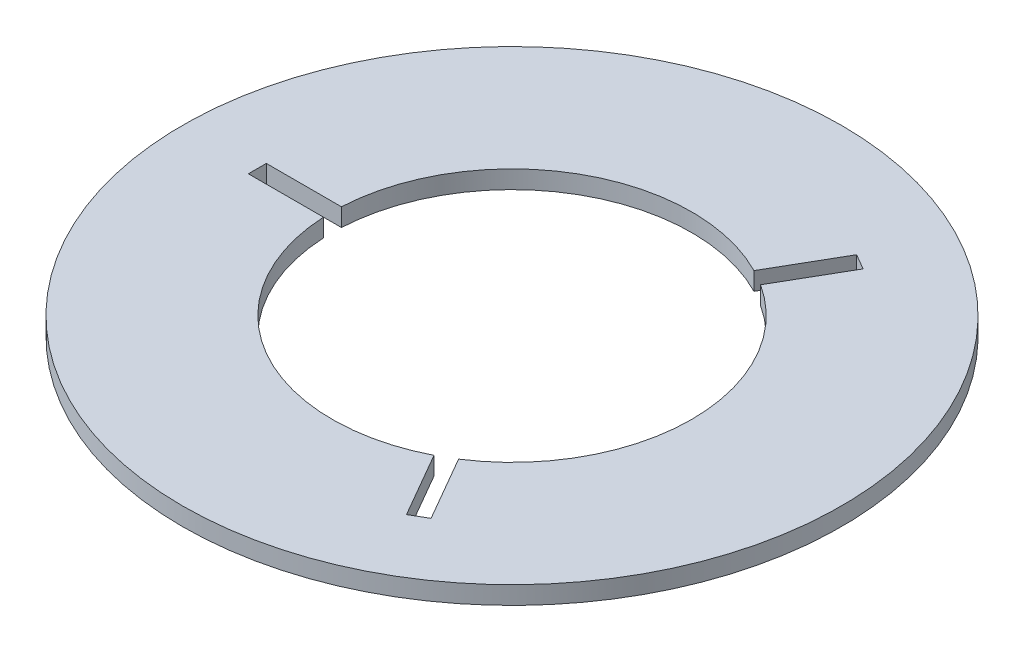
ISO-10303-21;
HEADER;
FILE_DESCRIPTION(('STEP AP214'),'2;1');
FILE_NAME('part.step','',(''),(''),'','','');
FILE_SCHEMA(('AUTOMOTIVE_DESIGN { 1 0 10303 214 1 1 1 1 }'));
ENDSEC;
DATA;
#1=APPLICATION_CONTEXT('core data for automotive mechanical design processes');
#2=APPLICATION_PROTOCOL_DEFINITION('international standard','automotive_design',2000,#1);
#3=PRODUCT_CONTEXT('',#1,'mechanical');
#4=PRODUCT('Part','Part','',(#3));
#5=PRODUCT_RELATED_PRODUCT_CATEGORY('part','',(#4));
#6=PRODUCT_DEFINITION_FORMATION('','',#4);
#7=PRODUCT_DEFINITION_CONTEXT('part definition',#1,'design');
#8=PRODUCT_DEFINITION('design','',#6,#7);
#9=PRODUCT_DEFINITION_SHAPE('','',#8);
#10=(LENGTH_UNIT() NAMED_UNIT(*) SI_UNIT(.MILLI.,.METRE.));
#11=(NAMED_UNIT(*) PLANE_ANGLE_UNIT() SI_UNIT($,.RADIAN.));
#12=(NAMED_UNIT(*) SI_UNIT($,.STERADIAN.) SOLID_ANGLE_UNIT());
#13=UNCERTAINTY_MEASURE_WITH_UNIT(LENGTH_MEASURE(1.E-05),#10,'distance_accuracy_value','');
#14=(GEOMETRIC_REPRESENTATION_CONTEXT(3) GLOBAL_UNCERTAINTY_ASSIGNED_CONTEXT((#13)) GLOBAL_UNIT_ASSIGNED_CONTEXT((#10,
#11,#12)) REPRESENTATION_CONTEXT('',''));
#15=CARTESIAN_POINT('',(0.,0.,0.));
#16=DIRECTION('',(0.,0.,1.));
#17=DIRECTION('',(1.,0.,0.));
#18=AXIS2_PLACEMENT_3D('',#15,#16,#17);
#19=CARTESIAN_POINT('',(0.,0.,0.));
#20=DIRECTION('',(0.,1.,0.));
#21=DIRECTION('',(0.,0.,1.));
#22=AXIS2_PLACEMENT_3D('',#19,#20,#21);
#23=CYLINDRICAL_SURFACE('',#22,30.);
#24=CARTESIAN_POINT('',(0.,0.,0.));
#25=DIRECTION('',(0.,1.,0.));
#26=DIRECTION('',(0.,0.,1.));
#27=AXIS2_PLACEMENT_3D('',#24,#25,#26);
#28=CIRCLE('',#27,30.);
#29=CARTESIAN_POINT('',(16.2802763722554,0.,25.1982658380092));
#30=VERTEX_POINT('',#29);
#31=CARTESIAN_POINT('',(16.280276372255,0.,-25.1982658380094));
#32=VERTEX_POINT('',#31);
#33=EDGE_CURVE('E195',#30,#32,#28,.T.);
#34=ORIENTED_EDGE('',*,*,#33,.F.);
#35=DIRECTION('',(0.,1.,0.));
#36=VECTOR('',#35,1.);
#37=CARTESIAN_POINT('',(16.2802763722554,0.,25.1982658380092));
#38=LINE('',#37,#36);
#39=CARTESIAN_POINT('',(16.2802763722554,3.,25.1982658380092));
#40=VERTEX_POINT('',#39);
#41=EDGE_CURVE('E11',#30,#40,#38,.T.);
#42=ORIENTED_EDGE('',*,*,#41,.T.);
#43=CARTESIAN_POINT('',(0.,3.,0.));
#44=DIRECTION('',(0.,1.,0.));
#45=DIRECTION('',(0.,0.,1.));
#46=AXIS2_PLACEMENT_3D('',#43,#44,#45);
#47=CIRCLE('',#46,30.);
#48=CARTESIAN_POINT('',(16.280276372255,3.,-25.1982658380094));
#49=VERTEX_POINT('',#48);
#50=EDGE_CURVE('E200',#40,#49,#47,.T.);
#51=ORIENTED_EDGE('',*,*,#50,.T.);
#52=DIRECTION('',(0.,1.,0.));
#53=VECTOR('',#52,1.);
#54=CARTESIAN_POINT('',(16.280276372255,0.,-25.1982658380094));
#55=LINE('',#54,#53);
#56=EDGE_CURVE('E212',#49,#32,#55,.F.);
#57=ORIENTED_EDGE('',*,*,#56,.T.);
#58=EDGE_LOOP('',(#34,#42,#51,#57));
#59=FACE_BOUND('',#58,.T.);
#60=ADVANCED_FACE('F33',(#59),#23,.F.);
#61=CARTESIAN_POINT('',(13.6822001609017,0.,-26.6982658380094));
#62=VERTEX_POINT('',#61);
#63=CARTESIAN_POINT('',(-29.9624765331573,0.,-1.49999999999999));
#64=VERTEX_POINT('',#63);
#65=EDGE_CURVE('E196',#62,#64,#28,.T.);
#66=ORIENTED_EDGE('',*,*,#65,.F.);
#67=DIRECTION('',(0.,1.,0.));
#68=VECTOR('',#67,1.);
#69=CARTESIAN_POINT('',(13.6822001609017,0.,-26.6982658380094));
#70=LINE('',#69,#68);
#71=CARTESIAN_POINT('',(13.6822001609017,3.,-26.6982658380094));
#72=VERTEX_POINT('',#71);
#73=EDGE_CURVE('E214',#62,#72,#70,.T.);
#74=ORIENTED_EDGE('',*,*,#73,.T.);
#75=CARTESIAN_POINT('',(-29.9624765331573,3.,-1.49999999999999));
#76=VERTEX_POINT('',#75);
#77=EDGE_CURVE('E190',#72,#76,#47,.T.);
#78=ORIENTED_EDGE('',*,*,#77,.T.);
#79=DIRECTION('',(0.,1.,0.));
#80=VECTOR('',#79,1.);
#81=CARTESIAN_POINT('',(-29.9624765331573,0.,-1.49999999999999));
#82=LINE('',#81,#80);
#83=EDGE_CURVE('E204',#76,#64,#82,.F.);
#84=ORIENTED_EDGE('',*,*,#83,.T.);
#85=EDGE_LOOP('',(#66,#74,#78,#84));
#86=FACE_BOUND('',#85,.T.);
#87=ADVANCED_FACE('F241',(#86),#23,.F.);
#88=CARTESIAN_POINT('',(0.,3.,0.));
#89=DIRECTION('',(0.,-1.,0.));
#90=DIRECTION('',(0.,0.,-1.));
#91=AXIS2_PLACEMENT_3D('',#88,#89,#90);
#92=CYLINDRICAL_SURFACE('',#91,55.);
#93=CARTESIAN_POINT('',(0.,3.,0.));
#94=DIRECTION('',(0.,1.,0.));
#95=DIRECTION('',(0.,0.,1.));
#96=AXIS2_PLACEMENT_3D('',#93,#94,#95);
#97=CIRCLE('',#96,55.);
#98=CARTESIAN_POINT('',(0.,3.,55.));
#99=VERTEX_POINT('',#98);
#100=EDGE_CURVE('E201',#99,#99,#97,.T.);
#101=ORIENTED_EDGE('',*,*,#100,.F.);
#102=EDGE_LOOP('',(#101));
#103=FACE_BOUND('',#102,.T.);
#104=CARTESIAN_POINT('',(0.,0.,0.));
#105=DIRECTION('',(0.,1.,0.));
#106=DIRECTION('',(0.,0.,1.));
#107=AXIS2_PLACEMENT_3D('',#104,#105,#106);
#108=CIRCLE('',#107,55.);
#109=CARTESIAN_POINT('',(0.,0.,55.));
#110=VERTEX_POINT('',#109);
#111=EDGE_CURVE('E194',#110,#110,#108,.T.);
#112=ORIENTED_EDGE('',*,*,#111,.T.);
#113=EDGE_LOOP('',(#112));
#114=FACE_BOUND('',#113,.T.);
#115=ADVANCED_FACE('F35',(#103,#114),#92,.T.);
#116=CARTESIAN_POINT('',(0.,3.,0.));
#117=DIRECTION('',(0.,1.,0.));
#118=DIRECTION('',(0.,0.,1.));
#119=AXIS2_PLACEMENT_3D('',#116,#117,#118);
#120=PLANE('',#119);
#121=DIRECTION('',(-0.500000000000004,0.,-0.866025403784436));
#122=VECTOR('',#121,1.);
#123=CARTESIAN_POINT('',(22.5490381056768,3.,36.0560796608385));
#124=LINE('',#123,#122);
#125=CARTESIAN_POINT('',(22.5490381056768,3.,36.0560796608385));
#126=VERTEX_POINT('',#125);
#127=EDGE_CURVE('E144',#126,#40,#124,.T.);
#128=ORIENTED_EDGE('',*,*,#127,.F.);
#129=DIRECTION('',(0.866025403784436,0.,-0.500000000000004));
#130=VECTOR('',#129,1.);
#131=CARTESIAN_POINT('',(19.9509618943235,3.,37.5560796608386));
#132=LINE('',#131,#130);
#133=CARTESIAN_POINT('',(19.9509618943235,3.,37.5560796608386));
#134=VERTEX_POINT('',#133);
#135=EDGE_CURVE('E146',#134,#126,#132,.T.);
#136=ORIENTED_EDGE('',*,*,#135,.F.);
#137=DIRECTION('',(0.500000000000004,0.,0.866025403784436));
#138=VECTOR('',#137,1.);
#139=CARTESIAN_POINT('',(19.9509618943235,3.,37.5560796608386));
#140=LINE('',#139,#138);
#141=CARTESIAN_POINT('',(13.6822001609021,3.,26.6982658380092));
#142=VERTEX_POINT('',#141);
#143=EDGE_CURVE('E124',#142,#134,#140,.T.);
#144=ORIENTED_EDGE('',*,*,#143,.F.);
#145=CARTESIAN_POINT('',(-29.9624765331573,3.,1.50000000000001));
#146=VERTEX_POINT('',#145);
#147=EDGE_CURVE('E197',#146,#142,#47,.T.);
#148=ORIENTED_EDGE('',*,*,#147,.F.);
#149=DIRECTION('',(1.,0.,0.));
#150=VECTOR('',#149,1.);
#151=CARTESIAN_POINT('',(-42.5,3.,1.50000000000001));
#152=LINE('',#151,#150);
#153=CARTESIAN_POINT('',(-42.5,3.,1.50000000000001));
#154=VERTEX_POINT('',#153);
#155=EDGE_CURVE('E177',#154,#146,#152,.T.);
#156=ORIENTED_EDGE('',*,*,#155,.F.);
#157=DIRECTION('',(0.,0.,1.));
#158=VECTOR('',#157,1.);
#159=CARTESIAN_POINT('',(-42.5,3.,-1.49999999999999));
#160=LINE('',#159,#158);
#161=CARTESIAN_POINT('',(-42.5,3.,-1.49999999999999));
#162=VERTEX_POINT('',#161);
#163=EDGE_CURVE('E184',#162,#154,#160,.T.);
#164=ORIENTED_EDGE('',*,*,#163,.F.);
#165=DIRECTION('',(-1.,0.,0.));
#166=VECTOR('',#165,1.);
#167=CARTESIAN_POINT('',(-42.5,3.,-1.49999999999999));
#168=LINE('',#167,#166);
#169=EDGE_CURVE('E153',#76,#162,#168,.T.);
#170=ORIENTED_EDGE('',*,*,#169,.F.);
#171=ORIENTED_EDGE('',*,*,#77,.F.);
#172=DIRECTION('',(-0.499999999999992,0.,0.866025403784443));
#173=VECTOR('',#172,1.);
#174=CARTESIAN_POINT('',(19.950961894323,3.,-37.5560796608388));
#175=LINE('',#174,#173);
#176=CARTESIAN_POINT('',(19.950961894323,3.,-37.5560796608388));
#177=VERTEX_POINT('',#176);
#178=EDGE_CURVE('E157',#177,#72,#175,.T.);
#179=ORIENTED_EDGE('',*,*,#178,.F.);
#180=DIRECTION('',(-0.866025403784443,0.,-0.499999999999992));
#181=VECTOR('',#180,1.);
#182=CARTESIAN_POINT('',(22.5490381056763,3.,-36.0560796608389));
#183=LINE('',#182,#181);
#184=CARTESIAN_POINT('',(22.5490381056763,3.,-36.0560796608389));
#185=VERTEX_POINT('',#184);
#186=EDGE_CURVE('E166',#185,#177,#183,.T.);
#187=ORIENTED_EDGE('',*,*,#186,.F.);
#188=DIRECTION('',(0.499999999999992,0.,-0.866025403784443));
#189=VECTOR('',#188,1.);
#190=CARTESIAN_POINT('',(22.5490381056763,3.,-36.0560796608389));
#191=LINE('',#190,#189);
#192=EDGE_CURVE('E164',#49,#185,#191,.T.);
#193=ORIENTED_EDGE('',*,*,#192,.F.);
#194=ORIENTED_EDGE('',*,*,#50,.F.);
#195=EDGE_LOOP('',(#128,#136,#144,#148,#156,#164,#170,#171,#179,#187,#193,#194));
#196=FACE_BOUND('',#195,.T.);
#197=ORIENTED_EDGE('',*,*,#100,.T.);
#198=EDGE_LOOP('',(#197));
#199=FACE_BOUND('',#198,.T.);
#200=ADVANCED_FACE('F221',(#196,#199),#120,.T.);
#201=CARTESIAN_POINT('',(0.,0.,0.));
#202=DIRECTION('',(0.,1.,0.));
#203=DIRECTION('',(0.,0.,1.));
#204=AXIS2_PLACEMENT_3D('',#201,#202,#203);
#205=PLANE('',#204);
#206=DIRECTION('',(0.866025403784436,0.,-0.500000000000004));
#207=VECTOR('',#206,1.);
#208=CARTESIAN_POINT('',(19.9509618943235,0.,37.5560796608386));
#209=LINE('',#208,#207);
#210=CARTESIAN_POINT('',(19.9509618943235,0.,37.5560796608386));
#211=VERTEX_POINT('',#210);
#212=CARTESIAN_POINT('',(22.5490381056768,0.,36.0560796608385));
#213=VERTEX_POINT('',#212);
#214=EDGE_CURVE('E132',#211,#213,#209,.T.);
#215=ORIENTED_EDGE('',*,*,#214,.T.);
#216=DIRECTION('',(-0.500000000000004,0.,-0.866025403784436));
#217=VECTOR('',#216,1.);
#218=CARTESIAN_POINT('',(22.5490381056768,0.,36.0560796608385));
#219=LINE('',#218,#217);
#220=EDGE_CURVE('E129',#213,#30,#219,.T.);
#221=ORIENTED_EDGE('',*,*,#220,.T.);
#222=ORIENTED_EDGE('',*,*,#33,.T.);
#223=DIRECTION('',(0.499999999999992,0.,-0.866025403784443));
#224=VECTOR('',#223,1.);
#225=CARTESIAN_POINT('',(22.5490381056763,0.,-36.0560796608389));
#226=LINE('',#225,#224);
#227=CARTESIAN_POINT('',(22.5490381056763,0.,-36.0560796608389));
#228=VERTEX_POINT('',#227);
#229=EDGE_CURVE('E48',#32,#228,#226,.T.);
#230=ORIENTED_EDGE('',*,*,#229,.T.);
#231=DIRECTION('',(-0.866025403784443,0.,-0.499999999999992));
#232=VECTOR('',#231,1.);
#233=CARTESIAN_POINT('',(22.5490381056763,0.,-36.0560796608389));
#234=LINE('',#233,#232);
#235=CARTESIAN_POINT('',(19.950961894323,0.,-37.5560796608388));
#236=VERTEX_POINT('',#235);
#237=EDGE_CURVE('E156',#228,#236,#234,.T.);
#238=ORIENTED_EDGE('',*,*,#237,.T.);
#239=DIRECTION('',(-0.499999999999992,0.,0.866025403784443));
#240=VECTOR('',#239,1.);
#241=CARTESIAN_POINT('',(19.950961894323,0.,-37.5560796608388));
#242=LINE('',#241,#240);
#243=EDGE_CURVE('E160',#236,#62,#242,.T.);
#244=ORIENTED_EDGE('',*,*,#243,.T.);
#245=ORIENTED_EDGE('',*,*,#65,.T.);
#246=DIRECTION('',(-1.,0.,0.));
#247=VECTOR('',#246,1.);
#248=CARTESIAN_POINT('',(-42.5,0.,-1.49999999999999));
#249=LINE('',#248,#247);
#250=CARTESIAN_POINT('',(-42.5,0.,-1.49999999999999));
#251=VERTEX_POINT('',#250);
#252=EDGE_CURVE('E173',#64,#251,#249,.T.);
#253=ORIENTED_EDGE('',*,*,#252,.T.);
#254=DIRECTION('',(0.,0.,1.));
#255=VECTOR('',#254,1.);
#256=CARTESIAN_POINT('',(-42.5,0.,-1.49999999999999));
#257=LINE('',#256,#255);
#258=CARTESIAN_POINT('',(-42.5,0.,1.50000000000001));
#259=VERTEX_POINT('',#258);
#260=EDGE_CURVE('E176',#251,#259,#257,.T.);
#261=ORIENTED_EDGE('',*,*,#260,.T.);
#262=DIRECTION('',(1.,0.,0.));
#263=VECTOR('',#262,1.);
#264=CARTESIAN_POINT('',(-42.5,0.,1.50000000000001));
#265=LINE('',#264,#263);
#266=CARTESIAN_POINT('',(-29.9624765331573,0.,1.50000000000001));
#267=VERTEX_POINT('',#266);
#268=EDGE_CURVE('E180',#259,#267,#265,.T.);
#269=ORIENTED_EDGE('',*,*,#268,.T.);
#270=CARTESIAN_POINT('',(13.6822001609021,0.,26.6982658380092));
#271=VERTEX_POINT('',#270);
#272=EDGE_CURVE('E143',#267,#271,#28,.T.);
#273=ORIENTED_EDGE('',*,*,#272,.T.);
#274=DIRECTION('',(0.500000000000004,0.,0.866025403784436));
#275=VECTOR('',#274,1.);
#276=CARTESIAN_POINT('',(19.9509618943235,0.,37.5560796608386));
#277=LINE('',#276,#275);
#278=EDGE_CURVE('E56',#271,#211,#277,.T.);
#279=ORIENTED_EDGE('',*,*,#278,.T.);
#280=EDGE_LOOP('',(#215,#221,#222,#230,#238,#244,#245,#253,#261,#269,#273,#279));
#281=FACE_BOUND('',#280,.T.);
#282=ORIENTED_EDGE('',*,*,#111,.F.);
#283=EDGE_LOOP('',(#282));
#284=FACE_BOUND('',#283,.T.);
#285=ADVANCED_FACE('F139',(#281,#284),#205,.F.);
#286=ORIENTED_EDGE('',*,*,#147,.T.);
#287=DIRECTION('',(0.,1.,0.));
#288=VECTOR('',#287,1.);
#289=CARTESIAN_POINT('',(13.6822001609021,0.,26.6982658380092));
#290=LINE('',#289,#288);
#291=EDGE_CURVE('E41',#142,#271,#290,.F.);
#292=ORIENTED_EDGE('',*,*,#291,.T.);
#293=ORIENTED_EDGE('',*,*,#272,.F.);
#294=DIRECTION('',(0.,1.,0.));
#295=VECTOR('',#294,1.);
#296=CARTESIAN_POINT('',(-29.9624765331573,0.,1.50000000000001));
#297=LINE('',#296,#295);
#298=EDGE_CURVE('E209',#267,#146,#297,.T.);
#299=ORIENTED_EDGE('',*,*,#298,.T.);
#300=EDGE_LOOP('',(#286,#292,#293,#299));
#301=FACE_BOUND('',#300,.T.);
#302=ADVANCED_FACE('F217',(#301),#23,.F.);
#303=CARTESIAN_POINT('',(-42.5,0.,1.50000000000001));
#304=DIRECTION('',(0.,0.,1.));
#305=DIRECTION('',(1.,0.,0.));
#306=AXIS2_PLACEMENT_3D('',#303,#304,#305);
#307=PLANE('',#306);
#308=ORIENTED_EDGE('',*,*,#268,.F.);
#309=DIRECTION('',(0.,1.,0.));
#310=VECTOR('',#309,1.);
#311=CARTESIAN_POINT('',(-42.5,0.,1.50000000000001));
#312=LINE('',#311,#310);
#313=EDGE_CURVE('E188',#259,#154,#312,.T.);
#314=ORIENTED_EDGE('',*,*,#313,.T.);
#315=ORIENTED_EDGE('',*,*,#155,.T.);
#316=ORIENTED_EDGE('',*,*,#298,.F.);
#317=EDGE_LOOP('',(#308,#314,#315,#316));
#318=FACE_BOUND('',#317,.T.);
#319=ADVANCED_FACE('F250',(#318),#307,.F.);
#320=CARTESIAN_POINT('',(-42.5,0.,-1.49999999999999));
#321=DIRECTION('',(0.,0.,-1.));
#322=DIRECTION('',(-1.,0.,0.));
#323=AXIS2_PLACEMENT_3D('',#320,#321,#322);
#324=PLANE('',#323);
#325=ORIENTED_EDGE('',*,*,#169,.T.);
#326=DIRECTION('',(0.,1.,0.));
#327=VECTOR('',#326,1.);
#328=CARTESIAN_POINT('',(-42.5,0.,-1.49999999999999));
#329=LINE('',#328,#327);
#330=EDGE_CURVE('E182',#251,#162,#329,.T.);
#331=ORIENTED_EDGE('',*,*,#330,.F.);
#332=ORIENTED_EDGE('',*,*,#252,.F.);
#333=ORIENTED_EDGE('',*,*,#83,.F.);
#334=EDGE_LOOP('',(#325,#331,#332,#333));
#335=FACE_BOUND('',#334,.T.);
#336=ADVANCED_FACE('F238',(#335),#324,.F.);
#337=CARTESIAN_POINT('',(-42.5,0.,-1.49999999999999));
#338=DIRECTION('',(-1.,0.,0.));
#339=DIRECTION('',(0.,0.,1.));
#340=AXIS2_PLACEMENT_3D('',#337,#338,#339);
#341=PLANE('',#340);
#342=ORIENTED_EDGE('',*,*,#163,.T.);
#343=ORIENTED_EDGE('',*,*,#313,.F.);
#344=ORIENTED_EDGE('',*,*,#260,.F.);
#345=ORIENTED_EDGE('',*,*,#330,.T.);
#346=EDGE_LOOP('',(#342,#343,#344,#345));
#347=FACE_BOUND('',#346,.T.);
#348=ADVANCED_FACE('F247',(#347),#341,.F.);
#349=CARTESIAN_POINT('',(19.950961894323,0.,-37.5560796608388));
#350=DIRECTION('',(-0.866025403784443,0.,-0.499999999999992));
#351=DIRECTION('',(-0.499999999999992,0.,0.866025403784443));
#352=AXIS2_PLACEMENT_3D('',#349,#350,#351);
#353=PLANE('',#352);
#354=ORIENTED_EDGE('',*,*,#243,.F.);
#355=DIRECTION('',(0.,1.,0.));
#356=VECTOR('',#355,1.);
#357=CARTESIAN_POINT('',(19.950961894323,0.,-37.5560796608388));
#358=LINE('',#357,#356);
#359=EDGE_CURVE('E151',#236,#177,#358,.T.);
#360=ORIENTED_EDGE('',*,*,#359,.T.);
#361=ORIENTED_EDGE('',*,*,#178,.T.);
#362=ORIENTED_EDGE('',*,*,#73,.F.);
#363=EDGE_LOOP('',(#354,#360,#361,#362));
#364=FACE_BOUND('',#363,.T.);
#365=ADVANCED_FACE('F283',(#364),#353,.F.);
#366=CARTESIAN_POINT('',(22.5490381056763,0.,-36.0560796608389));
#367=DIRECTION('',(0.866025403784443,0.,0.499999999999992));
#368=DIRECTION('',(0.499999999999992,0.,-0.866025403784443));
#369=AXIS2_PLACEMENT_3D('',#366,#367,#368);
#370=PLANE('',#369);
#371=ORIENTED_EDGE('',*,*,#192,.T.);
#372=DIRECTION('',(0.,1.,0.));
#373=VECTOR('',#372,1.);
#374=CARTESIAN_POINT('',(22.5490381056763,0.,-36.0560796608389));
#375=LINE('',#374,#373);
#376=EDGE_CURVE('E163',#228,#185,#375,.T.);
#377=ORIENTED_EDGE('',*,*,#376,.F.);
#378=ORIENTED_EDGE('',*,*,#229,.F.);
#379=ORIENTED_EDGE('',*,*,#56,.F.);
#380=EDGE_LOOP('',(#371,#377,#378,#379));
#381=FACE_BOUND('',#380,.T.);
#382=ADVANCED_FACE('F288',(#381),#370,.F.);
#383=CARTESIAN_POINT('',(22.5490381056763,0.,-36.0560796608389));
#384=DIRECTION('',(0.499999999999992,0.,-0.866025403784443));
#385=DIRECTION('',(-0.866025403784443,0.,-0.499999999999992));
#386=AXIS2_PLACEMENT_3D('',#383,#384,#385);
#387=PLANE('',#386);
#388=ORIENTED_EDGE('',*,*,#186,.T.);
#389=ORIENTED_EDGE('',*,*,#359,.F.);
#390=ORIENTED_EDGE('',*,*,#237,.F.);
#391=ORIENTED_EDGE('',*,*,#376,.T.);
#392=EDGE_LOOP('',(#388,#389,#390,#391));
#393=FACE_BOUND('',#392,.T.);
#394=ADVANCED_FACE('F300',(#393),#387,.F.);
#395=CARTESIAN_POINT('',(22.5490381056768,0.,36.0560796608385));
#396=DIRECTION('',(0.866025403784436,0.,-0.500000000000004));
#397=DIRECTION('',(-0.500000000000004,0.,-0.866025403784436));
#398=AXIS2_PLACEMENT_3D('',#395,#396,#397);
#399=PLANE('',#398);
#400=ORIENTED_EDGE('',*,*,#220,.F.);
#401=DIRECTION('',(0.,1.,0.));
#402=VECTOR('',#401,1.);
#403=CARTESIAN_POINT('',(22.5490381056768,0.,36.0560796608385));
#404=LINE('',#403,#402);
#405=EDGE_CURVE('E128',#213,#126,#404,.T.);
#406=ORIENTED_EDGE('',*,*,#405,.T.);
#407=ORIENTED_EDGE('',*,*,#127,.T.);
#408=ORIENTED_EDGE('',*,*,#41,.F.);
#409=EDGE_LOOP('',(#400,#406,#407,#408));
#410=FACE_BOUND('',#409,.T.);
#411=ADVANCED_FACE('F228',(#410),#399,.F.);
#412=CARTESIAN_POINT('',(19.9509618943235,0.,37.5560796608386));
#413=DIRECTION('',(-0.866025403784436,0.,0.500000000000004));
#414=DIRECTION('',(0.500000000000004,0.,0.866025403784436));
#415=AXIS2_PLACEMENT_3D('',#412,#413,#414);
#416=PLANE('',#415);
#417=ORIENTED_EDGE('',*,*,#143,.T.);
#418=DIRECTION('',(0.,1.,0.));
#419=VECTOR('',#418,1.);
#420=CARTESIAN_POINT('',(19.9509618943235,0.,37.5560796608386));
#421=LINE('',#420,#419);
#422=EDGE_CURVE('E120',#211,#134,#421,.T.);
#423=ORIENTED_EDGE('',*,*,#422,.F.);
#424=ORIENTED_EDGE('',*,*,#278,.F.);
#425=ORIENTED_EDGE('',*,*,#291,.F.);
#426=EDGE_LOOP('',(#417,#423,#424,#425));
#427=FACE_BOUND('',#426,.T.);
#428=ADVANCED_FACE('F122',(#427),#416,.F.);
#429=CARTESIAN_POINT('',(19.9509618943235,0.,37.5560796608386));
#430=DIRECTION('',(0.500000000000004,0.,0.866025403784436));
#431=DIRECTION('',(0.866025403784436,0.,-0.500000000000004));
#432=AXIS2_PLACEMENT_3D('',#429,#430,#431);
#433=PLANE('',#432);
#434=ORIENTED_EDGE('',*,*,#135,.T.);
#435=ORIENTED_EDGE('',*,*,#405,.F.);
#436=ORIENTED_EDGE('',*,*,#214,.F.);
#437=ORIENTED_EDGE('',*,*,#422,.T.);
#438=EDGE_LOOP('',(#434,#435,#436,#437));
#439=FACE_BOUND('',#438,.T.);
#440=ADVANCED_FACE('F133',(#439),#433,.F.);
#441=CLOSED_SHELL('',(#60,#87,#115,#200,#285,#302,#319,#336,#348,#365,#382,#394,#411,#428,#440));
#442=MANIFOLD_SOLID_BREP('B2',#441);
#443=ADVANCED_BREP_SHAPE_REPRESENTATION('',(#18,#442),#14);
#444=SHAPE_DEFINITION_REPRESENTATION(#9,#443);
ENDSEC;
END-ISO-10303-21;
